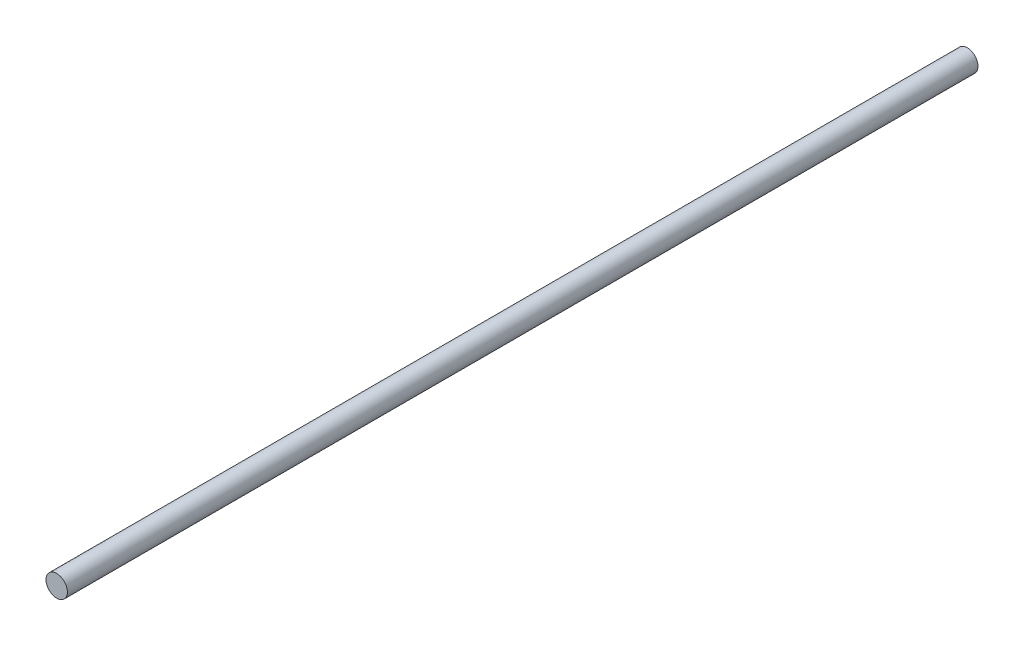
ISO-10303-21;
HEADER;
FILE_DESCRIPTION(('STEP AP214'),'2;1');
FILE_NAME('part.step','',(''),(''),'','','');
FILE_SCHEMA(('AUTOMOTIVE_DESIGN { 1 0 10303 214 1 1 1 1 }'));
ENDSEC;
DATA;
#1=APPLICATION_CONTEXT('core data for automotive mechanical design processes');
#2=APPLICATION_PROTOCOL_DEFINITION('international standard','automotive_design',2000,#1);
#3=PRODUCT_CONTEXT('',#1,'mechanical');
#4=PRODUCT('Part','Part','',(#3));
#5=PRODUCT_RELATED_PRODUCT_CATEGORY('part','',(#4));
#6=PRODUCT_DEFINITION_FORMATION('','',#4);
#7=PRODUCT_DEFINITION_CONTEXT('part definition',#1,'design');
#8=PRODUCT_DEFINITION('design','',#6,#7);
#9=PRODUCT_DEFINITION_SHAPE('','',#8);
#10=(LENGTH_UNIT() NAMED_UNIT(*) SI_UNIT(.MILLI.,.METRE.));
#11=(NAMED_UNIT(*) PLANE_ANGLE_UNIT() SI_UNIT($,.RADIAN.));
#12=(NAMED_UNIT(*) SI_UNIT($,.STERADIAN.) SOLID_ANGLE_UNIT());
#13=UNCERTAINTY_MEASURE_WITH_UNIT(LENGTH_MEASURE(1.E-05),#10,'distance_accuracy_value','');
#14=(GEOMETRIC_REPRESENTATION_CONTEXT(3) GLOBAL_UNCERTAINTY_ASSIGNED_CONTEXT((#13)) GLOBAL_UNIT_ASSIGNED_CONTEXT((#10,
#11,#12)) REPRESENTATION_CONTEXT('',''));
#15=CARTESIAN_POINT('',(0.,0.,0.));
#16=DIRECTION('',(0.,0.,1.));
#17=DIRECTION('',(1.,0.,0.));
#18=AXIS2_PLACEMENT_3D('',#15,#16,#17);
#19=CARTESIAN_POINT('',(0.,0.,339.6));
#20=DIRECTION('',(0.,0.,-1.));
#21=DIRECTION('',(-1.,0.,0.));
#22=AXIS2_PLACEMENT_3D('',#19,#20,#21);
#23=CYLINDRICAL_SURFACE('',#22,4.);
#24=CARTESIAN_POINT('',(0.,0.,339.6));
#25=DIRECTION('',(0.,0.,1.));
#26=DIRECTION('',(1.,0.,0.));
#27=AXIS2_PLACEMENT_3D('',#24,#25,#26);
#28=CIRCLE('',#27,4.);
#29=CARTESIAN_POINT('',(4.,0.,339.6));
#30=VERTEX_POINT('',#29);
#31=EDGE_CURVE('E10',#30,#30,#28,.T.);
#32=ORIENTED_EDGE('',*,*,#31,.F.);
#33=EDGE_LOOP('',(#32));
#34=FACE_BOUND('',#33,.T.);
#35=CARTESIAN_POINT('',(0.,0.,0.));
#36=DIRECTION('',(0.,0.,1.));
#37=DIRECTION('',(1.,0.,0.));
#38=AXIS2_PLACEMENT_3D('',#35,#36,#37);
#39=CIRCLE('',#38,4.);
#40=CARTESIAN_POINT('',(4.,0.,0.));
#41=VERTEX_POINT('',#40);
#42=EDGE_CURVE('E36',#41,#41,#39,.T.);
#43=ORIENTED_EDGE('',*,*,#42,.T.);
#44=EDGE_LOOP('',(#43));
#45=FACE_BOUND('',#44,.T.);
#46=ADVANCED_FACE('F33',(#34,#45),#23,.T.);
#47=CARTESIAN_POINT('',(0.,0.,339.6));
#48=DIRECTION('',(0.,0.,1.));
#49=DIRECTION('',(1.,0.,0.));
#50=AXIS2_PLACEMENT_3D('',#47,#48,#49);
#51=PLANE('',#50);
#52=ORIENTED_EDGE('',*,*,#31,.T.);
#53=EDGE_LOOP('',(#52));
#54=FACE_BOUND('',#53,.T.);
#55=ADVANCED_FACE('F48',(#54),#51,.T.);
#56=CARTESIAN_POINT('',(0.,0.,0.));
#57=DIRECTION('',(0.,0.,1.));
#58=DIRECTION('',(1.,0.,0.));
#59=AXIS2_PLACEMENT_3D('',#56,#57,#58);
#60=PLANE('',#59);
#61=ORIENTED_EDGE('',*,*,#42,.F.);
#62=EDGE_LOOP('',(#61));
#63=FACE_BOUND('',#62,.T.);
#64=ADVANCED_FACE('F46',(#63),#60,.F.);
#65=CLOSED_SHELL('',(#46,#55,#64));
#66=MANIFOLD_SOLID_BREP('B2',#65);
#67=ADVANCED_BREP_SHAPE_REPRESENTATION('',(#18,#66),#14);
#68=SHAPE_DEFINITION_REPRESENTATION(#9,#67);
ENDSEC;
END-ISO-10303-21;
